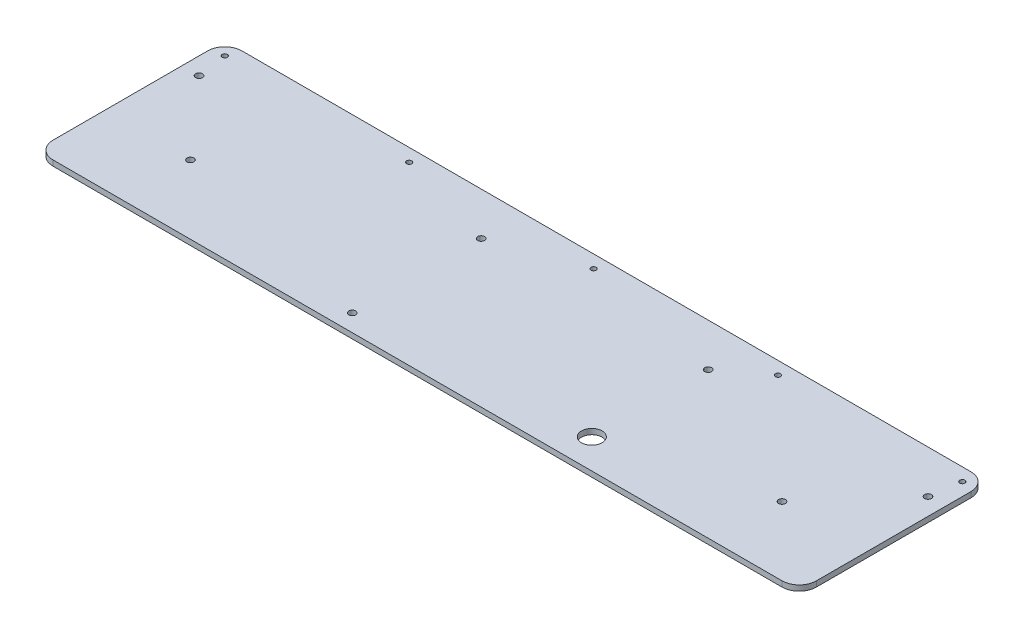
ISO-10303-21;
HEADER;
FILE_DESCRIPTION(('STEP AP214'),'2;1');
FILE_NAME('part.step','',(''),(''),'','','');
FILE_SCHEMA(('AUTOMOTIVE_DESIGN { 1 0 10303 214 1 1 1 1 }'));
ENDSEC;
DATA;
#1=APPLICATION_CONTEXT('core data for automotive mechanical design processes');
#2=APPLICATION_PROTOCOL_DEFINITION('international standard','automotive_design',2000,#1);
#3=PRODUCT_CONTEXT('',#1,'mechanical');
#4=PRODUCT('Part','Part','',(#3));
#5=PRODUCT_RELATED_PRODUCT_CATEGORY('part','',(#4));
#6=PRODUCT_DEFINITION_FORMATION('','',#4);
#7=PRODUCT_DEFINITION_CONTEXT('part definition',#1,'design');
#8=PRODUCT_DEFINITION('design','',#6,#7);
#9=PRODUCT_DEFINITION_SHAPE('','',#8);
#10=(LENGTH_UNIT() NAMED_UNIT(*) SI_UNIT(.MILLI.,.METRE.));
#11=(NAMED_UNIT(*) PLANE_ANGLE_UNIT() SI_UNIT($,.RADIAN.));
#12=(NAMED_UNIT(*) SI_UNIT($,.STERADIAN.) SOLID_ANGLE_UNIT());
#13=UNCERTAINTY_MEASURE_WITH_UNIT(LENGTH_MEASURE(1.E-05),#10,'distance_accuracy_value','');
#14=(GEOMETRIC_REPRESENTATION_CONTEXT(3) GLOBAL_UNCERTAINTY_ASSIGNED_CONTEXT((#13)) GLOBAL_UNIT_ASSIGNED_CONTEXT((#10,
#11,#12)) REPRESENTATION_CONTEXT('',''));
#15=CARTESIAN_POINT('',(0.,0.,0.));
#16=DIRECTION('',(0.,0.,1.));
#17=DIRECTION('',(1.,0.,0.));
#18=AXIS2_PLACEMENT_3D('',#15,#16,#17);
#19=CARTESIAN_POINT('',(-26.7995775349074,3.175,0.));
#20=DIRECTION('',(-1.,0.,0.));
#21=DIRECTION('',(0.,0.,1.));
#22=AXIS2_PLACEMENT_3D('',#19,#20,#21);
#23=PLANE('',#22);
#24=DIRECTION('',(0.,0.,-1.));
#25=VECTOR('',#24,1.);
#26=CARTESIAN_POINT('',(-26.7995775349074,0.,0.));
#27=LINE('',#26,#25);
#28=CARTESIAN_POINT('',(-26.7995775349074,0.,-10.));
#29=VERTEX_POINT('',#28);
#30=CARTESIAN_POINT('',(-26.7995775349074,0.,-100.));
#31=VERTEX_POINT('',#30);
#32=EDGE_CURVE('E106',#29,#31,#27,.T.);
#33=ORIENTED_EDGE('',*,*,#32,.F.);
#34=DIRECTION('',(0.,-1.,0.));
#35=VECTOR('',#34,1.);
#36=CARTESIAN_POINT('',(-26.7995775349074,3.175,-10.));
#37=LINE('',#36,#35);
#38=CARTESIAN_POINT('',(-26.7995775349074,3.175,-10.));
#39=VERTEX_POINT('',#38);
#40=EDGE_CURVE('E11',#29,#39,#37,.F.);
#41=ORIENTED_EDGE('',*,*,#40,.T.);
#42=DIRECTION('',(0.,0.,-1.));
#43=VECTOR('',#42,1.);
#44=CARTESIAN_POINT('',(-26.7995775349074,3.175,0.));
#45=LINE('',#44,#43);
#46=CARTESIAN_POINT('',(-26.7995775349074,3.175,-100.));
#47=VERTEX_POINT('',#46);
#48=EDGE_CURVE('E158',#39,#47,#45,.T.);
#49=ORIENTED_EDGE('',*,*,#48,.T.);
#50=DIRECTION('',(0.,-1.,0.));
#51=VECTOR('',#50,1.);
#52=CARTESIAN_POINT('',(-26.7995775349074,3.175,-100.));
#53=LINE('',#52,#51);
#54=EDGE_CURVE('E42',#47,#31,#53,.T.);
#55=ORIENTED_EDGE('',*,*,#54,.T.);
#56=EDGE_LOOP('',(#33,#41,#49,#55));
#57=FACE_BOUND('',#56,.T.);
#58=ADVANCED_FACE('F34',(#57),#23,.T.);
#59=CARTESIAN_POINT('',(0.,3.175,0.));
#60=DIRECTION('',(0.,0.,-1.));
#61=DIRECTION('',(-1.,0.,0.));
#62=AXIS2_PLACEMENT_3D('',#59,#60,#61);
#63=PLANE('',#62);
#64=DIRECTION('',(1.,0.,0.));
#65=VECTOR('',#64,1.);
#66=CARTESIAN_POINT('',(0.,0.,0.));
#67=LINE('',#66,#65);
#68=CARTESIAN_POINT('',(-16.7995775349074,0.,0.));
#69=VERTEX_POINT('',#68);
#70=CARTESIAN_POINT('',(407.700422465093,0.,0.));
#71=VERTEX_POINT('',#70);
#72=EDGE_CURVE('E209',#69,#71,#67,.T.);
#73=ORIENTED_EDGE('',*,*,#72,.T.);
#74=DIRECTION('',(0.,-1.,0.));
#75=VECTOR('',#74,1.);
#76=CARTESIAN_POINT('',(407.700422465093,3.175,0.));
#77=LINE('',#76,#75);
#78=CARTESIAN_POINT('',(407.700422465093,3.175,0.));
#79=VERTEX_POINT('',#78);
#80=EDGE_CURVE('E49',#71,#79,#77,.F.);
#81=ORIENTED_EDGE('',*,*,#80,.T.);
#82=DIRECTION('',(1.,0.,0.));
#83=VECTOR('',#82,1.);
#84=CARTESIAN_POINT('',(0.,3.175,0.));
#85=LINE('',#84,#83);
#86=CARTESIAN_POINT('',(-16.7995775349074,3.175,0.));
#87=VERTEX_POINT('',#86);
#88=EDGE_CURVE('E159',#87,#79,#85,.T.);
#89=ORIENTED_EDGE('',*,*,#88,.F.);
#90=DIRECTION('',(0.,-1.,0.));
#91=VECTOR('',#90,1.);
#92=CARTESIAN_POINT('',(-16.7995775349074,0.,0.));
#93=LINE('',#92,#91);
#94=EDGE_CURVE('E152',#87,#69,#93,.T.);
#95=ORIENTED_EDGE('',*,*,#94,.T.);
#96=EDGE_LOOP('',(#73,#81,#89,#95));
#97=FACE_BOUND('',#96,.T.);
#98=ADVANCED_FACE('F294',(#97),#63,.F.);
#99=CARTESIAN_POINT('',(417.700422465093,3.175,0.));
#100=DIRECTION('',(-1.,0.,0.));
#101=DIRECTION('',(0.,0.,1.));
#102=AXIS2_PLACEMENT_3D('',#99,#100,#101);
#103=PLANE('',#102);
#104=DIRECTION('',(0.,0.,-1.));
#105=VECTOR('',#104,1.);
#106=CARTESIAN_POINT('',(417.700422465093,0.,0.));
#107=LINE('',#106,#105);
#108=CARTESIAN_POINT('',(417.700422465093,0.,-10.));
#109=VERTEX_POINT('',#108);
#110=CARTESIAN_POINT('',(417.700422465093,0.,-100.));
#111=VERTEX_POINT('',#110);
#112=EDGE_CURVE('E122',#109,#111,#107,.T.);
#113=ORIENTED_EDGE('',*,*,#112,.T.);
#114=DIRECTION('',(0.,-1.,0.));
#115=VECTOR('',#114,1.);
#116=CARTESIAN_POINT('',(417.700422465093,3.175,-100.));
#117=LINE('',#116,#115);
#118=CARTESIAN_POINT('',(417.700422465093,3.175,-100.));
#119=VERTEX_POINT('',#118);
#120=EDGE_CURVE('E144',#111,#119,#117,.F.);
#121=ORIENTED_EDGE('',*,*,#120,.T.);
#122=DIRECTION('',(0.,0.,-1.));
#123=VECTOR('',#122,1.);
#124=CARTESIAN_POINT('',(417.700422465093,3.175,0.));
#125=LINE('',#124,#123);
#126=CARTESIAN_POINT('',(417.700422465093,3.175,-10.));
#127=VERTEX_POINT('',#126);
#128=EDGE_CURVE('E162',#127,#119,#125,.T.);
#129=ORIENTED_EDGE('',*,*,#128,.F.);
#130=DIRECTION('',(0.,-1.,0.));
#131=VECTOR('',#130,1.);
#132=CARTESIAN_POINT('',(417.700422465093,3.175,-10.));
#133=LINE('',#132,#131);
#134=EDGE_CURVE('E141',#127,#109,#133,.T.);
#135=ORIENTED_EDGE('',*,*,#134,.T.);
#136=EDGE_LOOP('',(#113,#121,#129,#135));
#137=FACE_BOUND('',#136,.T.);
#138=ADVANCED_FACE('F299',(#137),#103,.F.);
#139=CARTESIAN_POINT('',(279.700422465093,3.175,-17.2281586800001));
#140=DIRECTION('',(0.,-1.,0.));
#141=DIRECTION('',(0.,0.,-1.));
#142=AXIS2_PLACEMENT_3D('',#139,#140,#141);
#143=CYLINDRICAL_SURFACE('',#142,5.99999999999999);
#144=CARTESIAN_POINT('',(279.700422465093,3.175,-17.2281586800001));
#145=DIRECTION('',(0.,1.,0.));
#146=DIRECTION('',(0.,0.,1.));
#147=AXIS2_PLACEMENT_3D('',#144,#145,#146);
#148=CIRCLE('',#147,5.99999999999999);
#149=CARTESIAN_POINT('',(279.700422465093,3.175,-11.2281586800001));
#150=VERTEX_POINT('',#149);
#151=EDGE_CURVE('E130',#150,#150,#148,.T.);
#152=ORIENTED_EDGE('',*,*,#151,.T.);
#153=EDGE_LOOP('',(#152));
#154=FACE_BOUND('',#153,.T.);
#155=CARTESIAN_POINT('',(279.700422465093,0.,-17.2281586800001));
#156=DIRECTION('',(0.,1.,0.));
#157=DIRECTION('',(0.,0.,1.));
#158=AXIS2_PLACEMENT_3D('',#155,#156,#157);
#159=CIRCLE('',#158,5.99999999999999);
#160=CARTESIAN_POINT('',(279.700422465093,0.,-11.2281586800001));
#161=VERTEX_POINT('',#160);
#162=EDGE_CURVE('E235',#161,#161,#159,.T.);
#163=ORIENTED_EDGE('',*,*,#162,.F.);
#164=EDGE_LOOP('',(#163));
#165=FACE_BOUND('',#164,.T.);
#166=ADVANCED_FACE('F330',(#154,#165),#143,.F.);
#167=CARTESIAN_POINT('',(88.0754224650926,3.175,-102.5));
#168=DIRECTION('',(0.,-1.,0.));
#169=DIRECTION('',(0.,0.,-1.));
#170=AXIS2_PLACEMENT_3D('',#167,#168,#169);
#171=CYLINDRICAL_SURFACE('',#170,1.5);
#172=CARTESIAN_POINT('',(88.0754224650926,3.175,-102.5));
#173=DIRECTION('',(0.,1.,0.));
#174=DIRECTION('',(0.,0.,1.));
#175=AXIS2_PLACEMENT_3D('',#172,#173,#174);
#176=CIRCLE('',#175,1.5);
#177=CARTESIAN_POINT('',(88.0754224650926,3.175,-101.));
#178=VERTEX_POINT('',#177);
#179=EDGE_CURVE('E194',#178,#178,#176,.T.);
#180=ORIENTED_EDGE('',*,*,#179,.T.);
#181=EDGE_LOOP('',(#180));
#182=FACE_BOUND('',#181,.T.);
#183=CARTESIAN_POINT('',(88.0754224650926,0.,-102.5));
#184=DIRECTION('',(0.,1.,0.));
#185=DIRECTION('',(0.,0.,1.));
#186=AXIS2_PLACEMENT_3D('',#183,#184,#185);
#187=CIRCLE('',#186,1.5);
#188=CARTESIAN_POINT('',(88.0754224650926,0.,-101.));
#189=VERTEX_POINT('',#188);
#190=EDGE_CURVE('E233',#189,#189,#187,.T.);
#191=ORIENTED_EDGE('',*,*,#190,.F.);
#192=EDGE_LOOP('',(#191));
#193=FACE_BOUND('',#192,.T.);
#194=ADVANCED_FACE('F334',(#182,#193),#171,.F.);
#195=CARTESIAN_POINT('',(-19.2995775349074,3.175,-102.5));
#196=DIRECTION('',(0.,-1.,0.));
#197=DIRECTION('',(0.,0.,-1.));
#198=AXIS2_PLACEMENT_3D('',#195,#196,#197);
#199=CYLINDRICAL_SURFACE('',#198,1.5);
#200=CARTESIAN_POINT('',(-19.2995775349074,3.175,-102.5));
#201=DIRECTION('',(0.,1.,0.));
#202=DIRECTION('',(0.,0.,1.));
#203=AXIS2_PLACEMENT_3D('',#200,#201,#202);
#204=CIRCLE('',#203,1.5);
#205=CARTESIAN_POINT('',(-19.2995775349074,3.175,-101.));
#206=VERTEX_POINT('',#205);
#207=EDGE_CURVE('E191',#206,#206,#204,.T.);
#208=ORIENTED_EDGE('',*,*,#207,.T.);
#209=EDGE_LOOP('',(#208));
#210=FACE_BOUND('',#209,.T.);
#211=CARTESIAN_POINT('',(-19.2995775349074,0.,-102.5));
#212=DIRECTION('',(0.,1.,0.));
#213=DIRECTION('',(0.,0.,1.));
#214=AXIS2_PLACEMENT_3D('',#211,#212,#213);
#215=CIRCLE('',#214,1.5);
#216=CARTESIAN_POINT('',(-19.2995775349074,0.,-101.));
#217=VERTEX_POINT('',#216);
#218=EDGE_CURVE('E230',#217,#217,#215,.T.);
#219=ORIENTED_EDGE('',*,*,#218,.F.);
#220=EDGE_LOOP('',(#219));
#221=FACE_BOUND('',#220,.T.);
#222=ADVANCED_FACE('F362',(#210,#221),#199,.F.);
#223=CARTESIAN_POINT('',(367.700422465093,3.175,-40.));
#224=DIRECTION('',(0.,-1.,0.));
#225=DIRECTION('',(0.,0.,-1.));
#226=AXIS2_PLACEMENT_3D('',#223,#224,#225);
#227=CYLINDRICAL_SURFACE('',#226,2.);
#228=CARTESIAN_POINT('',(367.700422465093,3.175,-40.));
#229=DIRECTION('',(0.,1.,0.));
#230=DIRECTION('',(0.,0.,1.));
#231=AXIS2_PLACEMENT_3D('',#228,#229,#230);
#232=CIRCLE('',#231,2.);
#233=CARTESIAN_POINT('',(367.700422465093,3.175,-38.));
#234=VERTEX_POINT('',#233);
#235=EDGE_CURVE('E188',#234,#234,#232,.T.);
#236=ORIENTED_EDGE('',*,*,#235,.T.);
#237=EDGE_LOOP('',(#236));
#238=FACE_BOUND('',#237,.T.);
#239=CARTESIAN_POINT('',(367.700422465093,0.,-40.));
#240=DIRECTION('',(0.,1.,0.));
#241=DIRECTION('',(0.,0.,1.));
#242=AXIS2_PLACEMENT_3D('',#239,#240,#241);
#243=CIRCLE('',#242,2.);
#244=CARTESIAN_POINT('',(367.700422465093,0.,-38.));
#245=VERTEX_POINT('',#244);
#246=EDGE_CURVE('E227',#245,#245,#243,.T.);
#247=ORIENTED_EDGE('',*,*,#246,.F.);
#248=EDGE_LOOP('',(#247));
#249=FACE_BOUND('',#248,.T.);
#250=ADVANCED_FACE('F358',(#238,#249),#227,.F.);
#251=CARTESIAN_POINT('',(410.200422465093,3.175,-102.5));
#252=DIRECTION('',(0.,-1.,0.));
#253=DIRECTION('',(0.,0.,-1.));
#254=AXIS2_PLACEMENT_3D('',#251,#252,#253);
#255=CYLINDRICAL_SURFACE('',#254,1.50000000000002);
#256=CARTESIAN_POINT('',(410.200422465093,3.175,-102.5));
#257=DIRECTION('',(0.,1.,0.));
#258=DIRECTION('',(0.,0.,1.));
#259=AXIS2_PLACEMENT_3D('',#256,#257,#258);
#260=CIRCLE('',#259,1.50000000000002);
#261=CARTESIAN_POINT('',(410.200422465093,3.175,-101.));
#262=VERTEX_POINT('',#261);
#263=EDGE_CURVE('E185',#262,#262,#260,.T.);
#264=ORIENTED_EDGE('',*,*,#263,.T.);
#265=EDGE_LOOP('',(#264));
#266=FACE_BOUND('',#265,.T.);
#267=CARTESIAN_POINT('',(410.200422465093,0.,-102.5));
#268=DIRECTION('',(0.,1.,0.));
#269=DIRECTION('',(0.,0.,1.));
#270=AXIS2_PLACEMENT_3D('',#267,#268,#269);
#271=CIRCLE('',#270,1.50000000000002);
#272=CARTESIAN_POINT('',(410.200422465093,0.,-101.));
#273=VERTEX_POINT('',#272);
#274=EDGE_CURVE('E224',#273,#273,#271,.T.);
#275=ORIENTED_EDGE('',*,*,#274,.F.);
#276=EDGE_LOOP('',(#275));
#277=FACE_BOUND('',#276,.T.);
#278=ADVANCED_FACE('F354',(#266,#277),#255,.F.);
#279=CARTESIAN_POINT('',(302.825422465093,3.175,-102.5));
#280=DIRECTION('',(0.,-1.,0.));
#281=DIRECTION('',(0.,0.,-1.));
#282=AXIS2_PLACEMENT_3D('',#279,#280,#281);
#283=CYLINDRICAL_SURFACE('',#282,1.50000000000002);
#284=CARTESIAN_POINT('',(302.825422465093,3.175,-102.5));
#285=DIRECTION('',(0.,1.,0.));
#286=DIRECTION('',(0.,0.,1.));
#287=AXIS2_PLACEMENT_3D('',#284,#285,#286);
#288=CIRCLE('',#287,1.50000000000002);
#289=CARTESIAN_POINT('',(302.825422465093,3.175,-101.));
#290=VERTEX_POINT('',#289);
#291=EDGE_CURVE('E182',#290,#290,#288,.T.);
#292=ORIENTED_EDGE('',*,*,#291,.T.);
#293=EDGE_LOOP('',(#292));
#294=FACE_BOUND('',#293,.T.);
#295=CARTESIAN_POINT('',(302.825422465093,0.,-102.5));
#296=DIRECTION('',(0.,1.,0.));
#297=DIRECTION('',(0.,0.,1.));
#298=AXIS2_PLACEMENT_3D('',#295,#296,#297);
#299=CIRCLE('',#298,1.50000000000002);
#300=CARTESIAN_POINT('',(302.825422465093,0.,-101.));
#301=VERTEX_POINT('',#300);
#302=EDGE_CURVE('E221',#301,#301,#299,.T.);
#303=ORIENTED_EDGE('',*,*,#302,.F.);
#304=EDGE_LOOP('',(#303));
#305=FACE_BOUND('',#304,.T.);
#306=ADVANCED_FACE('F350',(#294,#305),#283,.F.);
#307=CARTESIAN_POINT('',(195.450422465093,3.175,-102.5));
#308=DIRECTION('',(0.,-1.,0.));
#309=DIRECTION('',(0.,0.,-1.));
#310=AXIS2_PLACEMENT_3D('',#307,#308,#309);
#311=CYLINDRICAL_SURFACE('',#310,1.5);
#312=CARTESIAN_POINT('',(195.450422465093,3.175,-102.5));
#313=DIRECTION('',(0.,1.,0.));
#314=DIRECTION('',(0.,0.,1.));
#315=AXIS2_PLACEMENT_3D('',#312,#313,#314);
#316=CIRCLE('',#315,1.5);
#317=CARTESIAN_POINT('',(195.450422465093,3.175,-101.));
#318=VERTEX_POINT('',#317);
#319=EDGE_CURVE('E179',#318,#318,#316,.T.);
#320=ORIENTED_EDGE('',*,*,#319,.T.);
#321=EDGE_LOOP('',(#320));
#322=FACE_BOUND('',#321,.T.);
#323=CARTESIAN_POINT('',(195.450422465093,0.,-102.5));
#324=DIRECTION('',(0.,1.,0.));
#325=DIRECTION('',(0.,0.,1.));
#326=AXIS2_PLACEMENT_3D('',#323,#324,#325);
#327=CIRCLE('',#326,1.5);
#328=CARTESIAN_POINT('',(195.450422465093,0.,-101.));
#329=VERTEX_POINT('',#328);
#330=EDGE_CURVE('E218',#329,#329,#327,.T.);
#331=ORIENTED_EDGE('',*,*,#330,.F.);
#332=EDGE_LOOP('',(#331));
#333=FACE_BOUND('',#332,.T.);
#334=ADVANCED_FACE('F346',(#322,#333),#311,.F.);
#335=CARTESIAN_POINT('',(407.700422465093,3.175,-85.));
#336=DIRECTION('',(0.,-1.,0.));
#337=DIRECTION('',(0.,0.,-1.));
#338=AXIS2_PLACEMENT_3D('',#335,#336,#337);
#339=CYLINDRICAL_SURFACE('',#338,2.);
#340=CARTESIAN_POINT('',(407.700422465093,3.175,-85.));
#341=DIRECTION('',(0.,1.,0.));
#342=DIRECTION('',(0.,0.,1.));
#343=AXIS2_PLACEMENT_3D('',#340,#341,#342);
#344=CIRCLE('',#343,2.);
#345=CARTESIAN_POINT('',(407.700422465093,3.175,-83.));
#346=VERTEX_POINT('',#345);
#347=EDGE_CURVE('E176',#346,#346,#344,.T.);
#348=ORIENTED_EDGE('',*,*,#347,.T.);
#349=EDGE_LOOP('',(#348));
#350=FACE_BOUND('',#349,.T.);
#351=CARTESIAN_POINT('',(407.700422465093,0.,-85.));
#352=DIRECTION('',(0.,1.,0.));
#353=DIRECTION('',(0.,0.,1.));
#354=AXIS2_PLACEMENT_3D('',#351,#352,#353);
#355=CIRCLE('',#354,2.);
#356=CARTESIAN_POINT('',(407.700422465093,0.,-83.));
#357=VERTEX_POINT('',#356);
#358=EDGE_CURVE('E215',#357,#357,#355,.T.);
#359=ORIENTED_EDGE('',*,*,#358,.F.);
#360=EDGE_LOOP('',(#359));
#361=FACE_BOUND('',#360,.T.);
#362=ADVANCED_FACE('F342',(#350,#361),#339,.F.);
#363=CARTESIAN_POINT('',(-16.7995775349074,3.175,-85.));
#364=DIRECTION('',(0.,-1.,0.));
#365=DIRECTION('',(0.,0.,-1.));
#366=AXIS2_PLACEMENT_3D('',#363,#364,#365);
#367=CYLINDRICAL_SURFACE('',#366,2.);
#368=CARTESIAN_POINT('',(-16.7995775349074,3.175,-85.));
#369=DIRECTION('',(0.,1.,0.));
#370=DIRECTION('',(0.,0.,1.));
#371=AXIS2_PLACEMENT_3D('',#368,#369,#370);
#372=CIRCLE('',#371,2.);
#373=CARTESIAN_POINT('',(-16.7995775349074,3.175,-83.));
#374=VERTEX_POINT('',#373);
#375=EDGE_CURVE('E173',#374,#374,#372,.T.);
#376=ORIENTED_EDGE('',*,*,#375,.T.);
#377=EDGE_LOOP('',(#376));
#378=FACE_BOUND('',#377,.T.);
#379=CARTESIAN_POINT('',(-16.7995775349074,0.,-85.));
#380=DIRECTION('',(0.,1.,0.));
#381=DIRECTION('',(0.,0.,1.));
#382=AXIS2_PLACEMENT_3D('',#379,#380,#381);
#383=CIRCLE('',#382,2.);
#384=CARTESIAN_POINT('',(-16.7995775349074,0.,-83.));
#385=VERTEX_POINT('',#384);
#386=EDGE_CURVE('E121',#385,#385,#383,.T.);
#387=ORIENTED_EDGE('',*,*,#386,.F.);
#388=EDGE_LOOP('',(#387));
#389=FACE_BOUND('',#388,.T.);
#390=ADVANCED_FACE('F339',(#378,#389),#367,.F.);
#391=CARTESIAN_POINT('',(0.,3.175,-110.));
#392=DIRECTION('',(0.,0.,-1.));
#393=DIRECTION('',(-1.,0.,0.));
#394=AXIS2_PLACEMENT_3D('',#391,#392,#393);
#395=PLANE('',#394);
#396=DIRECTION('',(1.,0.,0.));
#397=VECTOR('',#396,1.);
#398=CARTESIAN_POINT('',(0.,3.175,-110.));
#399=LINE('',#398,#397);
#400=CARTESIAN_POINT('',(-16.7995775349074,3.175,-110.));
#401=VERTEX_POINT('',#400);
#402=CARTESIAN_POINT('',(407.700422465093,3.175,-110.));
#403=VERTEX_POINT('',#402);
#404=EDGE_CURVE('E171',#401,#403,#399,.T.);
#405=ORIENTED_EDGE('',*,*,#404,.T.);
#406=DIRECTION('',(0.,-1.,0.));
#407=VECTOR('',#406,1.);
#408=CARTESIAN_POINT('',(407.700422465093,0.,-110.));
#409=LINE('',#408,#407);
#410=CARTESIAN_POINT('',(407.700422465093,0.,-110.));
#411=VERTEX_POINT('',#410);
#412=EDGE_CURVE('E112',#403,#411,#409,.T.);
#413=ORIENTED_EDGE('',*,*,#412,.T.);
#414=DIRECTION('',(1.,0.,0.));
#415=VECTOR('',#414,1.);
#416=CARTESIAN_POINT('',(0.,0.,-110.));
#417=LINE('',#416,#415);
#418=CARTESIAN_POINT('',(-16.7995775349074,0.,-110.));
#419=VERTEX_POINT('',#418);
#420=EDGE_CURVE('E104',#419,#411,#417,.T.);
#421=ORIENTED_EDGE('',*,*,#420,.F.);
#422=DIRECTION('',(0.,-1.,0.));
#423=VECTOR('',#422,1.);
#424=CARTESIAN_POINT('',(-16.7995775349074,3.175,-110.));
#425=LINE('',#424,#423);
#426=EDGE_CURVE('E118',#419,#401,#425,.F.);
#427=ORIENTED_EDGE('',*,*,#426,.T.);
#428=EDGE_LOOP('',(#405,#413,#421,#427));
#429=FACE_BOUND('',#428,.T.);
#430=ADVANCED_FACE('F117',(#429),#395,.T.);
#431=CARTESIAN_POINT('',(279.700422465093,3.175,-85.));
#432=DIRECTION('',(0.,-1.,0.));
#433=DIRECTION('',(0.,0.,-1.));
#434=AXIS2_PLACEMENT_3D('',#431,#432,#433);
#435=CYLINDRICAL_SURFACE('',#434,2.);
#436=CARTESIAN_POINT('',(279.700422465093,3.175,-85.));
#437=DIRECTION('',(0.,1.,0.));
#438=DIRECTION('',(0.,0.,1.));
#439=AXIS2_PLACEMENT_3D('',#436,#437,#438);
#440=CIRCLE('',#439,2.);
#441=CARTESIAN_POINT('',(279.700422465093,3.175,-83.));
#442=VERTEX_POINT('',#441);
#443=EDGE_CURVE('E160',#442,#442,#440,.T.);
#444=ORIENTED_EDGE('',*,*,#443,.T.);
#445=EDGE_LOOP('',(#444));
#446=FACE_BOUND('',#445,.T.);
#447=CARTESIAN_POINT('',(279.700422465093,0.,-85.));
#448=DIRECTION('',(0.,1.,0.));
#449=DIRECTION('',(0.,0.,1.));
#450=AXIS2_PLACEMENT_3D('',#447,#448,#449);
#451=CIRCLE('',#450,2.);
#452=CARTESIAN_POINT('',(279.700422465093,0.,-83.));
#453=VERTEX_POINT('',#452);
#454=EDGE_CURVE('E205',#453,#453,#451,.T.);
#455=ORIENTED_EDGE('',*,*,#454,.F.);
#456=EDGE_LOOP('',(#455));
#457=FACE_BOUND('',#456,.T.);
#458=ADVANCED_FACE('F303',(#446,#457),#435,.F.);
#459=CARTESIAN_POINT('',(147.450422465093,3.175,-85.));
#460=DIRECTION('',(0.,-1.,0.));
#461=DIRECTION('',(0.,0.,-1.));
#462=AXIS2_PLACEMENT_3D('',#459,#460,#461);
#463=CYLINDRICAL_SURFACE('',#462,2.);
#464=CARTESIAN_POINT('',(147.450422465093,3.175,-85.));
#465=DIRECTION('',(0.,1.,0.));
#466=DIRECTION('',(0.,0.,1.));
#467=AXIS2_PLACEMENT_3D('',#464,#465,#466);
#468=CIRCLE('',#467,2.);
#469=CARTESIAN_POINT('',(147.450422465093,3.175,-83.));
#470=VERTEX_POINT('',#469);
#471=EDGE_CURVE('E165',#470,#470,#468,.T.);
#472=ORIENTED_EDGE('',*,*,#471,.T.);
#473=EDGE_LOOP('',(#472));
#474=FACE_BOUND('',#473,.T.);
#475=CARTESIAN_POINT('',(147.450422465093,0.,-85.));
#476=DIRECTION('',(0.,1.,0.));
#477=DIRECTION('',(0.,0.,1.));
#478=AXIS2_PLACEMENT_3D('',#475,#476,#477);
#479=CIRCLE('',#478,2.);
#480=CARTESIAN_POINT('',(147.450422465093,0.,-83.));
#481=VERTEX_POINT('',#480);
#482=EDGE_CURVE('E202',#481,#481,#479,.T.);
#483=ORIENTED_EDGE('',*,*,#482,.F.);
#484=EDGE_LOOP('',(#483));
#485=FACE_BOUND('',#484,.T.);
#486=ADVANCED_FACE('F250',(#474,#485),#463,.F.);
#487=CARTESIAN_POINT('',(23.2004224650926,3.175,-40.));
#488=DIRECTION('',(0.,-1.,0.));
#489=DIRECTION('',(0.,0.,-1.));
#490=AXIS2_PLACEMENT_3D('',#487,#488,#489);
#491=CYLINDRICAL_SURFACE('',#490,2.);
#492=CARTESIAN_POINT('',(23.2004224650926,3.175,-40.));
#493=DIRECTION('',(0.,1.,0.));
#494=DIRECTION('',(0.,0.,1.));
#495=AXIS2_PLACEMENT_3D('',#492,#493,#494);
#496=CIRCLE('',#495,2.);
#497=CARTESIAN_POINT('',(23.2004224650926,3.175,-38.));
#498=VERTEX_POINT('',#497);
#499=EDGE_CURVE('E240',#498,#498,#496,.T.);
#500=ORIENTED_EDGE('',*,*,#499,.T.);
#501=EDGE_LOOP('',(#500));
#502=FACE_BOUND('',#501,.T.);
#503=CARTESIAN_POINT('',(23.2004224650926,0.,-40.));
#504=DIRECTION('',(0.,1.,0.));
#505=DIRECTION('',(0.,0.,1.));
#506=AXIS2_PLACEMENT_3D('',#503,#504,#505);
#507=CIRCLE('',#506,2.);
#508=CARTESIAN_POINT('',(23.2004224650926,0.,-38.));
#509=VERTEX_POINT('',#508);
#510=EDGE_CURVE('E199',#509,#509,#507,.T.);
#511=ORIENTED_EDGE('',*,*,#510,.F.);
#512=EDGE_LOOP('',(#511));
#513=FACE_BOUND('',#512,.T.);
#514=ADVANCED_FACE('F285',(#502,#513),#491,.F.);
#515=CARTESIAN_POINT('',(147.450422465093,3.175,-10.));
#516=DIRECTION('',(0.,-1.,0.));
#517=DIRECTION('',(0.,0.,-1.));
#518=AXIS2_PLACEMENT_3D('',#515,#516,#517);
#519=CYLINDRICAL_SURFACE('',#518,2.);
#520=CARTESIAN_POINT('',(147.450422465093,3.175,-10.));
#521=DIRECTION('',(0.,1.,0.));
#522=DIRECTION('',(0.,0.,1.));
#523=AXIS2_PLACEMENT_3D('',#520,#521,#522);
#524=CIRCLE('',#523,2.);
#525=CARTESIAN_POINT('',(147.450422465093,3.175,-8.00000000000001));
#526=VERTEX_POINT('',#525);
#527=EDGE_CURVE('E126',#526,#526,#524,.T.);
#528=ORIENTED_EDGE('',*,*,#527,.T.);
#529=EDGE_LOOP('',(#528));
#530=FACE_BOUND('',#529,.T.);
#531=CARTESIAN_POINT('',(147.450422465093,0.,-10.));
#532=DIRECTION('',(0.,1.,0.));
#533=DIRECTION('',(0.,0.,1.));
#534=AXIS2_PLACEMENT_3D('',#531,#532,#533);
#535=CIRCLE('',#534,2.);
#536=CARTESIAN_POINT('',(147.450422465093,0.,-8.00000000000001));
#537=VERTEX_POINT('',#536);
#538=EDGE_CURVE('E133',#537,#537,#535,.T.);
#539=ORIENTED_EDGE('',*,*,#538,.F.);
#540=EDGE_LOOP('',(#539));
#541=FACE_BOUND('',#540,.T.);
#542=ADVANCED_FACE('F256',(#530,#541),#519,.F.);
#543=CARTESIAN_POINT('',(0.,3.175,0.));
#544=DIRECTION('',(0.,1.,0.));
#545=DIRECTION('',(0.,0.,1.));
#546=AXIS2_PLACEMENT_3D('',#543,#544,#545);
#547=PLANE('',#546);
#548=ORIENTED_EDGE('',*,*,#499,.F.);
#549=EDGE_LOOP('',(#548));
#550=FACE_BOUND('',#549,.T.);
#551=ORIENTED_EDGE('',*,*,#471,.F.);
#552=EDGE_LOOP('',(#551));
#553=FACE_BOUND('',#552,.T.);
#554=ORIENTED_EDGE('',*,*,#443,.F.);
#555=EDGE_LOOP('',(#554));
#556=FACE_BOUND('',#555,.T.);
#557=ORIENTED_EDGE('',*,*,#128,.T.);
#558=CARTESIAN_POINT('',(407.700422465093,3.175,-100.));
#559=DIRECTION('',(0.,1.,0.));
#560=DIRECTION('',(0.,0.,1.));
#561=AXIS2_PLACEMENT_3D('',#558,#559,#560);
#562=CIRCLE('',#561,10.);
#563=EDGE_CURVE('E150',#119,#403,#562,.T.);
#564=ORIENTED_EDGE('',*,*,#563,.T.);
#565=ORIENTED_EDGE('',*,*,#404,.F.);
#566=CARTESIAN_POINT('',(-16.7995775349074,3.175,-100.));
#567=DIRECTION('',(0.,1.,0.));
#568=DIRECTION('',(0.,0.,1.));
#569=AXIS2_PLACEMENT_3D('',#566,#567,#568);
#570=CIRCLE('',#569,10.);
#571=EDGE_CURVE('E125',#401,#47,#570,.T.);
#572=ORIENTED_EDGE('',*,*,#571,.T.);
#573=ORIENTED_EDGE('',*,*,#48,.F.);
#574=CARTESIAN_POINT('',(-16.7995775349074,3.175,-10.));
#575=DIRECTION('',(0.,1.,0.));
#576=DIRECTION('',(0.,0.,1.));
#577=AXIS2_PLACEMENT_3D('',#574,#575,#576);
#578=CIRCLE('',#577,10.);
#579=EDGE_CURVE('E56',#39,#87,#578,.T.);
#580=ORIENTED_EDGE('',*,*,#579,.T.);
#581=ORIENTED_EDGE('',*,*,#88,.T.);
#582=CARTESIAN_POINT('',(407.700422465093,3.175,-10.));
#583=DIRECTION('',(0.,1.,0.));
#584=DIRECTION('',(0.,0.,1.));
#585=AXIS2_PLACEMENT_3D('',#582,#583,#584);
#586=CIRCLE('',#585,10.);
#587=EDGE_CURVE('E148',#79,#127,#586,.T.);
#588=ORIENTED_EDGE('',*,*,#587,.T.);
#589=EDGE_LOOP('',(#557,#564,#565,#572,#573,#580,#581,#588));
#590=FACE_BOUND('',#589,.T.);
#591=ORIENTED_EDGE('',*,*,#375,.F.);
#592=EDGE_LOOP('',(#591));
#593=FACE_BOUND('',#592,.T.);
#594=ORIENTED_EDGE('',*,*,#347,.F.);
#595=EDGE_LOOP('',(#594));
#596=FACE_BOUND('',#595,.T.);
#597=ORIENTED_EDGE('',*,*,#319,.F.);
#598=EDGE_LOOP('',(#597));
#599=FACE_BOUND('',#598,.T.);
#600=ORIENTED_EDGE('',*,*,#291,.F.);
#601=EDGE_LOOP('',(#600));
#602=FACE_BOUND('',#601,.T.);
#603=ORIENTED_EDGE('',*,*,#263,.F.);
#604=EDGE_LOOP('',(#603));
#605=FACE_BOUND('',#604,.T.);
#606=ORIENTED_EDGE('',*,*,#235,.F.);
#607=EDGE_LOOP('',(#606));
#608=FACE_BOUND('',#607,.T.);
#609=ORIENTED_EDGE('',*,*,#207,.F.);
#610=EDGE_LOOP('',(#609));
#611=FACE_BOUND('',#610,.T.);
#612=ORIENTED_EDGE('',*,*,#179,.F.);
#613=EDGE_LOOP('',(#612));
#614=FACE_BOUND('',#613,.T.);
#615=ORIENTED_EDGE('',*,*,#151,.F.);
#616=EDGE_LOOP('',(#615));
#617=FACE_BOUND('',#616,.T.);
#618=ORIENTED_EDGE('',*,*,#527,.F.);
#619=EDGE_LOOP('',(#618));
#620=FACE_BOUND('',#619,.T.);
#621=ADVANCED_FACE('F253',(#550,#553,#556,#590,#593,#596,#599,#602,#605,#608,#611,#614,#617,
#620),#547,.T.);
#622=CARTESIAN_POINT('',(0.,0.,0.));
#623=DIRECTION('',(0.,1.,0.));
#624=DIRECTION('',(0.,0.,1.));
#625=AXIS2_PLACEMENT_3D('',#622,#623,#624);
#626=PLANE('',#625);
#627=ORIENTED_EDGE('',*,*,#510,.T.);
#628=EDGE_LOOP('',(#627));
#629=FACE_BOUND('',#628,.T.);
#630=ORIENTED_EDGE('',*,*,#482,.T.);
#631=EDGE_LOOP('',(#630));
#632=FACE_BOUND('',#631,.T.);
#633=ORIENTED_EDGE('',*,*,#454,.T.);
#634=EDGE_LOOP('',(#633));
#635=FACE_BOUND('',#634,.T.);
#636=ORIENTED_EDGE('',*,*,#420,.T.);
#637=CARTESIAN_POINT('',(407.700422465093,0.,-100.));
#638=DIRECTION('',(0.,1.,0.));
#639=DIRECTION('',(0.,0.,1.));
#640=AXIS2_PLACEMENT_3D('',#637,#638,#639);
#641=CIRCLE('',#640,10.);
#642=EDGE_CURVE('E139',#411,#111,#641,.F.);
#643=ORIENTED_EDGE('',*,*,#642,.T.);
#644=ORIENTED_EDGE('',*,*,#112,.F.);
#645=CARTESIAN_POINT('',(407.700422465093,0.,-10.));
#646=DIRECTION('',(0.,1.,0.));
#647=DIRECTION('',(0.,0.,1.));
#648=AXIS2_PLACEMENT_3D('',#645,#646,#647);
#649=CIRCLE('',#648,10.);
#650=EDGE_CURVE('E137',#109,#71,#649,.F.);
#651=ORIENTED_EDGE('',*,*,#650,.T.);
#652=ORIENTED_EDGE('',*,*,#72,.F.);
#653=CARTESIAN_POINT('',(-16.7995775349074,0.,-10.));
#654=DIRECTION('',(0.,1.,0.));
#655=DIRECTION('',(0.,0.,1.));
#656=AXIS2_PLACEMENT_3D('',#653,#654,#655);
#657=CIRCLE('',#656,10.);
#658=EDGE_CURVE('E111',#69,#29,#657,.F.);
#659=ORIENTED_EDGE('',*,*,#658,.T.);
#660=ORIENTED_EDGE('',*,*,#32,.T.);
#661=CARTESIAN_POINT('',(-16.7995775349074,0.,-100.));
#662=DIRECTION('',(0.,1.,0.));
#663=DIRECTION('',(0.,0.,1.));
#664=AXIS2_PLACEMENT_3D('',#661,#662,#663);
#665=CIRCLE('',#664,10.);
#666=EDGE_CURVE('E100',#31,#419,#665,.F.);
#667=ORIENTED_EDGE('',*,*,#666,.T.);
#668=EDGE_LOOP('',(#636,#643,#644,#651,#652,#659,#660,#667));
#669=FACE_BOUND('',#668,.T.);
#670=ORIENTED_EDGE('',*,*,#386,.T.);
#671=EDGE_LOOP('',(#670));
#672=FACE_BOUND('',#671,.T.);
#673=ORIENTED_EDGE('',*,*,#358,.T.);
#674=EDGE_LOOP('',(#673));
#675=FACE_BOUND('',#674,.T.);
#676=ORIENTED_EDGE('',*,*,#330,.T.);
#677=EDGE_LOOP('',(#676));
#678=FACE_BOUND('',#677,.T.);
#679=ORIENTED_EDGE('',*,*,#302,.T.);
#680=EDGE_LOOP('',(#679));
#681=FACE_BOUND('',#680,.T.);
#682=ORIENTED_EDGE('',*,*,#274,.T.);
#683=EDGE_LOOP('',(#682));
#684=FACE_BOUND('',#683,.T.);
#685=ORIENTED_EDGE('',*,*,#246,.T.);
#686=EDGE_LOOP('',(#685));
#687=FACE_BOUND('',#686,.T.);
#688=ORIENTED_EDGE('',*,*,#218,.T.);
#689=EDGE_LOOP('',(#688));
#690=FACE_BOUND('',#689,.T.);
#691=ORIENTED_EDGE('',*,*,#190,.T.);
#692=EDGE_LOOP('',(#691));
#693=FACE_BOUND('',#692,.T.);
#694=ORIENTED_EDGE('',*,*,#162,.T.);
#695=EDGE_LOOP('',(#694));
#696=FACE_BOUND('',#695,.T.);
#697=ORIENTED_EDGE('',*,*,#538,.T.);
#698=EDGE_LOOP('',(#697));
#699=FACE_BOUND('',#698,.T.);
#700=ADVANCED_FACE('F102',(#629,#632,#635,#669,#672,#675,#678,#681,#684,#687,#690,#693,#696,
#699),#626,.F.);
#701=CARTESIAN_POINT('',(407.700422465093,3.175,-100.));
#702=DIRECTION('',(0.,1.,0.));
#703=DIRECTION('',(0.,0.,1.));
#704=AXIS2_PLACEMENT_3D('',#701,#702,#703);
#705=CYLINDRICAL_SURFACE('',#704,10.);
#706=ORIENTED_EDGE('',*,*,#563,.F.);
#707=ORIENTED_EDGE('',*,*,#120,.F.);
#708=ORIENTED_EDGE('',*,*,#642,.F.);
#709=ORIENTED_EDGE('',*,*,#412,.F.);
#710=EDGE_LOOP('',(#706,#707,#708,#709));
#711=FACE_BOUND('',#710,.T.);
#712=ADVANCED_FACE('F309',(#711),#705,.T.);
#713=CARTESIAN_POINT('',(407.700422465093,3.175,-10.));
#714=DIRECTION('',(0.,-1.,0.));
#715=DIRECTION('',(0.,0.,-1.));
#716=AXIS2_PLACEMENT_3D('',#713,#714,#715);
#717=CYLINDRICAL_SURFACE('',#716,10.);
#718=ORIENTED_EDGE('',*,*,#587,.F.);
#719=ORIENTED_EDGE('',*,*,#80,.F.);
#720=ORIENTED_EDGE('',*,*,#650,.F.);
#721=ORIENTED_EDGE('',*,*,#134,.F.);
#722=EDGE_LOOP('',(#718,#719,#720,#721));
#723=FACE_BOUND('',#722,.T.);
#724=ADVANCED_FACE('F312',(#723),#717,.T.);
#725=CARTESIAN_POINT('',(-16.7995775349074,3.175,-10.));
#726=DIRECTION('',(0.,1.,0.));
#727=DIRECTION('',(0.,0.,1.));
#728=AXIS2_PLACEMENT_3D('',#725,#726,#727);
#729=CYLINDRICAL_SURFACE('',#728,10.);
#730=ORIENTED_EDGE('',*,*,#579,.F.);
#731=ORIENTED_EDGE('',*,*,#40,.F.);
#732=ORIENTED_EDGE('',*,*,#658,.F.);
#733=ORIENTED_EDGE('',*,*,#94,.F.);
#734=EDGE_LOOP('',(#730,#731,#732,#733));
#735=FACE_BOUND('',#734,.T.);
#736=ADVANCED_FACE('F315',(#735),#729,.T.);
#737=CARTESIAN_POINT('',(-16.7995775349074,3.175,-100.));
#738=DIRECTION('',(0.,-1.,0.));
#739=DIRECTION('',(0.,0.,-1.));
#740=AXIS2_PLACEMENT_3D('',#737,#738,#739);
#741=CYLINDRICAL_SURFACE('',#740,10.);
#742=ORIENTED_EDGE('',*,*,#571,.F.);
#743=ORIENTED_EDGE('',*,*,#426,.F.);
#744=ORIENTED_EDGE('',*,*,#666,.F.);
#745=ORIENTED_EDGE('',*,*,#54,.F.);
#746=EDGE_LOOP('',(#742,#743,#744,#745));
#747=FACE_BOUND('',#746,.T.);
#748=ADVANCED_FACE('F36',(#747),#741,.T.);
#749=CLOSED_SHELL('',(#58,#98,#138,#166,#194,#222,#250,#278,#306,#334,#362,#390,#430,#458,#486,
#514,#542,#621,#700,#712,#724,#736,#748));
#750=MANIFOLD_SOLID_BREP('B2',#749);
#751=ADVANCED_BREP_SHAPE_REPRESENTATION('',(#18,#750),#14);
#752=SHAPE_DEFINITION_REPRESENTATION(#9,#751);
ENDSEC;
END-ISO-10303-21;
